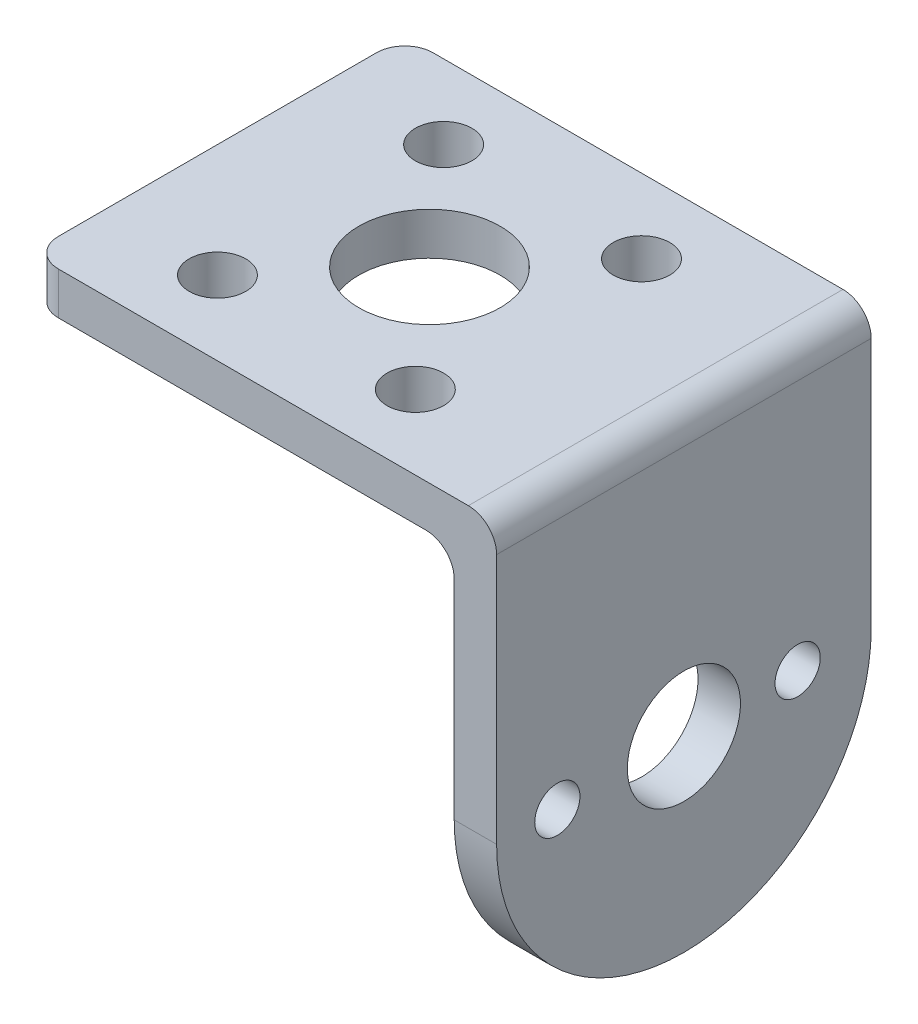
ISO-10303-21;
HEADER;
FILE_DESCRIPTION(('STEP AP214'),'2;1');
FILE_NAME('part.step','',(''),(''),'','','');
FILE_SCHEMA(('AUTOMOTIVE_DESIGN { 1 0 10303 214 1 1 1 1 }'));
ENDSEC;
DATA;
#1=APPLICATION_CONTEXT('core data for automotive mechanical design processes');
#2=APPLICATION_PROTOCOL_DEFINITION('international standard','automotive_design',2000,#1);
#3=PRODUCT_CONTEXT('',#1,'mechanical');
#4=PRODUCT('Part','Part','',(#3));
#5=PRODUCT_RELATED_PRODUCT_CATEGORY('part','',(#4));
#6=PRODUCT_DEFINITION_FORMATION('','',#4);
#7=PRODUCT_DEFINITION_CONTEXT('part definition',#1,'design');
#8=PRODUCT_DEFINITION('design','',#6,#7);
#9=PRODUCT_DEFINITION_SHAPE('','',#8);
#10=(LENGTH_UNIT() NAMED_UNIT(*) SI_UNIT(.MILLI.,.METRE.));
#11=(NAMED_UNIT(*) PLANE_ANGLE_UNIT() SI_UNIT($,.RADIAN.));
#12=(NAMED_UNIT(*) SI_UNIT($,.STERADIAN.) SOLID_ANGLE_UNIT());
#13=UNCERTAINTY_MEASURE_WITH_UNIT(LENGTH_MEASURE(1.E-05),#10,'distance_accuracy_value','');
#14=(GEOMETRIC_REPRESENTATION_CONTEXT(3) GLOBAL_UNCERTAINTY_ASSIGNED_CONTEXT((#13)) GLOBAL_UNIT_ASSIGNED_CONTEXT((#10,
#11,#12)) REPRESENTATION_CONTEXT('',''));
#15=CARTESIAN_POINT('',(0.,0.,0.));
#16=DIRECTION('',(0.,0.,1.));
#17=DIRECTION('',(1.,0.,0.));
#18=AXIS2_PLACEMENT_3D('',#15,#16,#17);
#19=CARTESIAN_POINT('',(-25.5407239819005,3.,-12.7703619909502));
#20=DIRECTION('',(1.,0.,0.));
#21=DIRECTION('',(0.,0.,-1.));
#22=AXIS2_PLACEMENT_3D('',#19,#20,#21);
#23=PLANE('',#22);
#24=DIRECTION('',(0.,0.,1.));
#25=VECTOR('',#24,1.);
#26=CARTESIAN_POINT('',(-25.5407239819005,3.,-12.7703619909502));
#27=LINE('',#26,#25);
#28=CARTESIAN_POINT('',(-25.5407239819005,3.,-10.7703619909502));
#29=VERTEX_POINT('',#28);
#30=CARTESIAN_POINT('',(-25.5407239819005,3.,11.7296380090498));
#31=VERTEX_POINT('',#30);
#32=EDGE_CURVE('E176',#29,#31,#27,.T.);
#33=ORIENTED_EDGE('',*,*,#32,.F.);
#34=DIRECTION('',(0.,-1.,0.));
#35=VECTOR('',#34,1.);
#36=CARTESIAN_POINT('',(-25.5407239819005,3.,-10.7703619909502));
#37=LINE('',#36,#35);
#38=CARTESIAN_POINT('',(-25.5407239819005,0.,-10.7703619909502));
#39=VERTEX_POINT('',#38);
#40=EDGE_CURVE('E192',#29,#39,#37,.T.);
#41=ORIENTED_EDGE('',*,*,#40,.T.);
#42=DIRECTION('',(0.,0.,1.));
#43=VECTOR('',#42,1.);
#44=CARTESIAN_POINT('',(-25.5407239819005,0.,-12.7703619909502));
#45=LINE('',#44,#43);
#46=CARTESIAN_POINT('',(-25.5407239819005,0.,11.7296380090498));
#47=VERTEX_POINT('',#46);
#48=EDGE_CURVE('E173',#39,#47,#45,.T.);
#49=ORIENTED_EDGE('',*,*,#48,.T.);
#50=DIRECTION('',(0.,-1.,0.));
#51=VECTOR('',#50,1.);
#52=CARTESIAN_POINT('',(-25.5407239819005,3.,11.7296380090498));
#53=LINE('',#52,#51);
#54=EDGE_CURVE('E184',#47,#31,#53,.F.);
#55=ORIENTED_EDGE('',*,*,#54,.T.);
#56=EDGE_LOOP('',(#33,#41,#49,#55));
#57=FACE_BOUND('',#56,.T.);
#58=ADVANCED_FACE('F35',(#57),#23,.F.);
#59=CARTESIAN_POINT('',(-25.5407239819005,3.,13.7296380090498));
#60=DIRECTION('',(0.,0.,-1.));
#61=DIRECTION('',(-1.,0.,0.));
#62=AXIS2_PLACEMENT_3D('',#59,#60,#61);
#63=PLANE('',#62);
#64=DIRECTION('',(0.,-1.,0.));
#65=VECTOR('',#64,1.);
#66=CARTESIAN_POINT('',(7.45927601809954,3.,13.7296380090498));
#67=LINE('',#66,#65);
#68=CARTESIAN_POINT('',(7.45927601809954,1.,13.7296380090498));
#69=VERTEX_POINT('',#68);
#70=CARTESIAN_POINT('',(7.45927601809954,-16.75,13.7296380090498));
#71=VERTEX_POINT('',#70);
#72=EDGE_CURVE('E111',#69,#71,#67,.T.);
#73=ORIENTED_EDGE('',*,*,#72,.F.);
#74=CARTESIAN_POINT('',(5.45927601809954,1.,13.7296380090498));
#75=DIRECTION('',(0.,0.,-1.));
#76=DIRECTION('',(-1.,0.,0.));
#77=AXIS2_PLACEMENT_3D('',#74,#75,#76);
#78=CIRCLE('',#77,2.);
#79=CARTESIAN_POINT('',(5.45927601809953,3.,13.7296380090498));
#80=VERTEX_POINT('',#79);
#81=EDGE_CURVE('E58',#69,#80,#78,.F.);
#82=ORIENTED_EDGE('',*,*,#81,.T.);
#83=DIRECTION('',(1.,0.,0.));
#84=VECTOR('',#83,1.);
#85=CARTESIAN_POINT('',(-25.5407239819005,3.,13.7296380090498));
#86=LINE('',#85,#84);
#87=CARTESIAN_POINT('',(-23.5407239819005,3.,13.7296380090498));
#88=VERTEX_POINT('',#87);
#89=EDGE_CURVE('E179',#88,#80,#86,.T.);
#90=ORIENTED_EDGE('',*,*,#89,.F.);
#91=DIRECTION('',(0.,-1.,0.));
#92=VECTOR('',#91,1.);
#93=CARTESIAN_POINT('',(-23.5407239819005,3.,13.7296380090498));
#94=LINE('',#93,#92);
#95=CARTESIAN_POINT('',(-23.5407239819005,0.,13.7296380090498));
#96=VERTEX_POINT('',#95);
#97=EDGE_CURVE('E207',#88,#96,#94,.T.);
#98=ORIENTED_EDGE('',*,*,#97,.T.);
#99=DIRECTION('',(1.,0.,0.));
#100=VECTOR('',#99,1.);
#101=CARTESIAN_POINT('',(-25.5407239819005,0.,13.7296380090498));
#102=LINE('',#101,#100);
#103=CARTESIAN_POINT('',(2.45927601809953,0.,13.7296380090498));
#104=VERTEX_POINT('',#103);
#105=EDGE_CURVE('E187',#96,#104,#102,.T.);
#106=ORIENTED_EDGE('',*,*,#105,.T.);
#107=CARTESIAN_POINT('',(2.45927601809954,-2.,13.7296380090498));
#108=DIRECTION('',(0.,0.,-1.));
#109=DIRECTION('',(-1.,0.,0.));
#110=AXIS2_PLACEMENT_3D('',#107,#108,#109);
#111=CIRCLE('',#110,2.);
#112=CARTESIAN_POINT('',(4.45927601809954,-2.,13.7296380090498));
#113=VERTEX_POINT('',#112);
#114=EDGE_CURVE('E11',#104,#113,#111,.T.);
#115=ORIENTED_EDGE('',*,*,#114,.T.);
#116=DIRECTION('',(0.,-1.,0.));
#117=VECTOR('',#116,1.);
#118=CARTESIAN_POINT('',(4.45927601809954,3.,13.7296380090498));
#119=LINE('',#118,#117);
#120=CARTESIAN_POINT('',(4.45927601809954,-16.75,13.7296380090498));
#121=VERTEX_POINT('',#120);
#122=EDGE_CURVE('E126',#113,#121,#119,.T.);
#123=ORIENTED_EDGE('',*,*,#122,.T.);
#124=DIRECTION('',(-1.,0.,0.));
#125=VECTOR('',#124,1.);
#126=CARTESIAN_POINT('',(7.45927601809954,-16.75,13.7296380090498));
#127=LINE('',#126,#125);
#128=EDGE_CURVE('E123',#71,#121,#127,.T.);
#129=ORIENTED_EDGE('',*,*,#128,.F.);
#130=EDGE_LOOP('',(#73,#82,#90,#98,#106,#115,#123,#129));
#131=FACE_BOUND('',#130,.T.);
#132=ADVANCED_FACE('F124',(#131),#63,.F.);
#133=CARTESIAN_POINT('',(-25.5407239819005,3.,-12.7703619909502));
#134=DIRECTION('',(0.,0.,1.));
#135=DIRECTION('',(1.,0.,0.));
#136=AXIS2_PLACEMENT_3D('',#133,#134,#135);
#137=PLANE('',#136);
#138=DIRECTION('',(-1.,0.,0.));
#139=VECTOR('',#138,1.);
#140=CARTESIAN_POINT('',(-25.5407239819005,3.,-12.7703619909502));
#141=LINE('',#140,#139);
#142=CARTESIAN_POINT('',(5.45927601809954,3.,-12.7703619909502));
#143=VERTEX_POINT('',#142);
#144=CARTESIAN_POINT('',(-23.5407239819005,3.,-12.7703619909502));
#145=VERTEX_POINT('',#144);
#146=EDGE_CURVE('E182',#143,#145,#141,.T.);
#147=ORIENTED_EDGE('',*,*,#146,.F.);
#148=CARTESIAN_POINT('',(5.45927601809953,1.,-12.7703619909502));
#149=DIRECTION('',(0.,0.,1.));
#150=DIRECTION('',(1.,0.,0.));
#151=AXIS2_PLACEMENT_3D('',#148,#149,#150);
#152=CIRCLE('',#151,2.);
#153=CARTESIAN_POINT('',(7.45927601809953,1.,-12.7703619909502));
#154=VERTEX_POINT('',#153);
#155=EDGE_CURVE('E218',#143,#154,#152,.F.);
#156=ORIENTED_EDGE('',*,*,#155,.T.);
#157=DIRECTION('',(0.,1.,0.));
#158=VECTOR('',#157,1.);
#159=CARTESIAN_POINT('',(7.45927601809953,3.,-12.7703619909502));
#160=LINE('',#159,#158);
#161=CARTESIAN_POINT('',(7.45927601809953,-16.75,-12.7703619909502));
#162=VERTEX_POINT('',#161);
#163=EDGE_CURVE('E120',#162,#154,#160,.T.);
#164=ORIENTED_EDGE('',*,*,#163,.F.);
#165=DIRECTION('',(-1.,0.,0.));
#166=VECTOR('',#165,1.);
#167=CARTESIAN_POINT('',(7.45927601809953,-16.75,-12.7703619909502));
#168=LINE('',#167,#166);
#169=CARTESIAN_POINT('',(4.45927601809953,-16.75,-12.7703619909502));
#170=VERTEX_POINT('',#169);
#171=EDGE_CURVE('E130',#162,#170,#168,.T.);
#172=ORIENTED_EDGE('',*,*,#171,.T.);
#173=DIRECTION('',(0.,1.,0.));
#174=VECTOR('',#173,1.);
#175=CARTESIAN_POINT('',(4.45927601809953,3.,-12.7703619909502));
#176=LINE('',#175,#174);
#177=CARTESIAN_POINT('',(4.45927601809953,-2.,-12.7703619909502));
#178=VERTEX_POINT('',#177);
#179=EDGE_CURVE('E139',#170,#178,#176,.T.);
#180=ORIENTED_EDGE('',*,*,#179,.T.);
#181=CARTESIAN_POINT('',(2.45927601809953,-2.,-12.7703619909502));
#182=DIRECTION('',(0.,0.,1.));
#183=DIRECTION('',(1.,0.,0.));
#184=AXIS2_PLACEMENT_3D('',#181,#182,#183);
#185=CIRCLE('',#184,2.);
#186=CARTESIAN_POINT('',(2.45927601809953,0.,-12.7703619909502));
#187=VERTEX_POINT('',#186);
#188=EDGE_CURVE('E43',#178,#187,#185,.T.);
#189=ORIENTED_EDGE('',*,*,#188,.T.);
#190=DIRECTION('',(-1.,0.,0.));
#191=VECTOR('',#190,1.);
#192=CARTESIAN_POINT('',(-25.5407239819005,0.,-12.7703619909502));
#193=LINE('',#192,#191);
#194=CARTESIAN_POINT('',(-23.5407239819005,0.,-12.7703619909502));
#195=VERTEX_POINT('',#194);
#196=EDGE_CURVE('E180',#187,#195,#193,.T.);
#197=ORIENTED_EDGE('',*,*,#196,.T.);
#198=DIRECTION('',(0.,-1.,0.));
#199=VECTOR('',#198,1.);
#200=CARTESIAN_POINT('',(-23.5407239819005,3.,-12.7703619909502));
#201=LINE('',#200,#199);
#202=EDGE_CURVE('E200',#195,#145,#201,.F.);
#203=ORIENTED_EDGE('',*,*,#202,.T.);
#204=EDGE_LOOP('',(#147,#156,#164,#172,#180,#189,#197,#203));
#205=FACE_BOUND('',#204,.T.);
#206=ADVANCED_FACE('F221',(#205),#137,.F.);
#207=CARTESIAN_POINT('',(0.,3.,0.));
#208=DIRECTION('',(0.,1.,0.));
#209=DIRECTION('',(0.,0.,1.));
#210=AXIS2_PLACEMENT_3D('',#207,#208,#209);
#211=PLANE('',#210);
#212=CARTESIAN_POINT('',(-17.5407239819005,3.,-7.52036199095022));
#213=DIRECTION('',(0.,1.,0.));
#214=DIRECTION('',(0.,0.,1.));
#215=AXIS2_PLACEMENT_3D('',#212,#213,#214);
#216=CIRCLE('',#215,2.);
#217=CARTESIAN_POINT('',(-17.5407239819005,3.,-5.52036199095022));
#218=VERTEX_POINT('',#217);
#219=EDGE_CURVE('E156',#218,#218,#216,.T.);
#220=ORIENTED_EDGE('',*,*,#219,.F.);
#221=EDGE_LOOP('',(#220));
#222=FACE_BOUND('',#221,.T.);
#223=CARTESIAN_POINT('',(-3.54072398190047,3.,8.47963800904978));
#224=DIRECTION('',(0.,1.,0.));
#225=DIRECTION('',(0.,0.,1.));
#226=AXIS2_PLACEMENT_3D('',#223,#224,#225);
#227=CIRCLE('',#226,2.);
#228=CARTESIAN_POINT('',(-3.54072398190047,3.,10.4796380090498));
#229=VERTEX_POINT('',#228);
#230=EDGE_CURVE('E149',#229,#229,#227,.T.);
#231=ORIENTED_EDGE('',*,*,#230,.F.);
#232=EDGE_LOOP('',(#231));
#233=FACE_BOUND('',#232,.T.);
#234=CARTESIAN_POINT('',(-17.5407239819005,3.,8.47963800904978));
#235=DIRECTION('',(0.,1.,0.));
#236=DIRECTION('',(0.,0.,1.));
#237=AXIS2_PLACEMENT_3D('',#234,#235,#236);
#238=CIRCLE('',#237,2.);
#239=CARTESIAN_POINT('',(-17.5407239819005,3.,10.4796380090498));
#240=VERTEX_POINT('',#239);
#241=EDGE_CURVE('E129',#240,#240,#238,.T.);
#242=ORIENTED_EDGE('',*,*,#241,.F.);
#243=EDGE_LOOP('',(#242));
#244=FACE_BOUND('',#243,.T.);
#245=CARTESIAN_POINT('',(-3.54072398190047,3.,-7.52036199095022));
#246=DIRECTION('',(0.,1.,0.));
#247=DIRECTION('',(0.,0.,1.));
#248=AXIS2_PLACEMENT_3D('',#245,#246,#247);
#249=CIRCLE('',#248,2.);
#250=CARTESIAN_POINT('',(-3.54072398190047,3.,-5.52036199095022));
#251=VERTEX_POINT('',#250);
#252=EDGE_CURVE('E155',#251,#251,#249,.T.);
#253=ORIENTED_EDGE('',*,*,#252,.F.);
#254=EDGE_LOOP('',(#253));
#255=FACE_BOUND('',#254,.T.);
#256=CARTESIAN_POINT('',(-10.5407239819005,3.,0.479638009049774));
#257=DIRECTION('',(0.,1.,0.));
#258=DIRECTION('',(0.,0.,1.));
#259=AXIS2_PLACEMENT_3D('',#256,#257,#258);
#260=CIRCLE('',#259,5.);
#261=CARTESIAN_POINT('',(-10.5407239819005,3.,5.47963800904977));
#262=VERTEX_POINT('',#261);
#263=EDGE_CURVE('E167',#262,#262,#260,.T.);
#264=ORIENTED_EDGE('',*,*,#263,.F.);
#265=EDGE_LOOP('',(#264));
#266=FACE_BOUND('',#265,.T.);
#267=ORIENTED_EDGE('',*,*,#89,.T.);
#268=DIRECTION('',(0.,0.,1.));
#269=VECTOR('',#268,1.);
#270=CARTESIAN_POINT('',(5.45927601809954,3.,0.));
#271=LINE('',#270,#269);
#272=EDGE_CURVE('E50',#80,#143,#271,.F.);
#273=ORIENTED_EDGE('',*,*,#272,.T.);
#274=ORIENTED_EDGE('',*,*,#146,.T.);
#275=CARTESIAN_POINT('',(-23.5407239819005,3.,-10.7703619909502));
#276=DIRECTION('',(0.,1.,0.));
#277=DIRECTION('',(0.,0.,1.));
#278=AXIS2_PLACEMENT_3D('',#275,#276,#277);
#279=CIRCLE('',#278,2.);
#280=EDGE_CURVE('E205',#145,#29,#279,.T.);
#281=ORIENTED_EDGE('',*,*,#280,.T.);
#282=ORIENTED_EDGE('',*,*,#32,.T.);
#283=CARTESIAN_POINT('',(-23.5407239819005,3.,11.7296380090498));
#284=DIRECTION('',(0.,1.,0.));
#285=DIRECTION('',(0.,0.,1.));
#286=AXIS2_PLACEMENT_3D('',#283,#284,#285);
#287=CIRCLE('',#286,2.);
#288=EDGE_CURVE('E203',#31,#88,#287,.T.);
#289=ORIENTED_EDGE('',*,*,#288,.T.);
#290=EDGE_LOOP('',(#267,#273,#274,#281,#282,#289));
#291=FACE_BOUND('',#290,.T.);
#292=ADVANCED_FACE('F338',(#222,#233,#244,#255,#266,#291),#211,.T.);
#293=CARTESIAN_POINT('',(0.,0.,0.));
#294=DIRECTION('',(0.,1.,0.));
#295=DIRECTION('',(0.,0.,1.));
#296=AXIS2_PLACEMENT_3D('',#293,#294,#295);
#297=PLANE('',#296);
#298=CARTESIAN_POINT('',(-17.5407239819005,0.,-7.52036199095022));
#299=DIRECTION('',(0.,1.,0.));
#300=DIRECTION('',(0.,0.,1.));
#301=AXIS2_PLACEMENT_3D('',#298,#299,#300);
#302=CIRCLE('',#301,2.);
#303=CARTESIAN_POINT('',(-17.5407239819005,0.,-5.52036199095022));
#304=VERTEX_POINT('',#303);
#305=EDGE_CURVE('E152',#304,#304,#302,.T.);
#306=ORIENTED_EDGE('',*,*,#305,.T.);
#307=EDGE_LOOP('',(#306));
#308=FACE_BOUND('',#307,.T.);
#309=CARTESIAN_POINT('',(-3.54072398190047,0.,8.47963800904978));
#310=DIRECTION('',(0.,1.,0.));
#311=DIRECTION('',(0.,0.,1.));
#312=AXIS2_PLACEMENT_3D('',#309,#310,#311);
#313=CIRCLE('',#312,2.);
#314=CARTESIAN_POINT('',(-3.54072398190047,0.,10.4796380090498));
#315=VERTEX_POINT('',#314);
#316=EDGE_CURVE('E159',#315,#315,#313,.T.);
#317=ORIENTED_EDGE('',*,*,#316,.T.);
#318=EDGE_LOOP('',(#317));
#319=FACE_BOUND('',#318,.T.);
#320=CARTESIAN_POINT('',(-17.5407239819005,0.,8.47963800904978));
#321=DIRECTION('',(0.,1.,0.));
#322=DIRECTION('',(0.,0.,1.));
#323=AXIS2_PLACEMENT_3D('',#320,#321,#322);
#324=CIRCLE('',#323,2.);
#325=CARTESIAN_POINT('',(-17.5407239819005,0.,10.4796380090498));
#326=VERTEX_POINT('',#325);
#327=EDGE_CURVE('E146',#326,#326,#324,.T.);
#328=ORIENTED_EDGE('',*,*,#327,.T.);
#329=EDGE_LOOP('',(#328));
#330=FACE_BOUND('',#329,.T.);
#331=CARTESIAN_POINT('',(-3.54072398190047,0.,-7.52036199095022));
#332=DIRECTION('',(0.,1.,0.));
#333=DIRECTION('',(0.,0.,1.));
#334=AXIS2_PLACEMENT_3D('',#331,#332,#333);
#335=CIRCLE('',#334,2.);
#336=CARTESIAN_POINT('',(-3.54072398190047,0.,-5.52036199095022));
#337=VERTEX_POINT('',#336);
#338=EDGE_CURVE('E164',#337,#337,#335,.T.);
#339=ORIENTED_EDGE('',*,*,#338,.T.);
#340=EDGE_LOOP('',(#339));
#341=FACE_BOUND('',#340,.T.);
#342=CARTESIAN_POINT('',(-10.5407239819005,0.,0.479638009049774));
#343=DIRECTION('',(0.,1.,0.));
#344=DIRECTION('',(0.,0.,1.));
#345=AXIS2_PLACEMENT_3D('',#342,#343,#344);
#346=CIRCLE('',#345,5.);
#347=CARTESIAN_POINT('',(-10.5407239819005,0.,5.47963800904977));
#348=VERTEX_POINT('',#347);
#349=EDGE_CURVE('E170',#348,#348,#346,.T.);
#350=ORIENTED_EDGE('',*,*,#349,.T.);
#351=EDGE_LOOP('',(#350));
#352=FACE_BOUND('',#351,.T.);
#353=ORIENTED_EDGE('',*,*,#196,.F.);
#354=DIRECTION('',(0.,0.,-1.));
#355=VECTOR('',#354,1.);
#356=CARTESIAN_POINT('',(2.45927601809954,0.,13.7296380090498));
#357=LINE('',#356,#355);
#358=EDGE_CURVE('E213',#187,#104,#357,.F.);
#359=ORIENTED_EDGE('',*,*,#358,.T.);
#360=ORIENTED_EDGE('',*,*,#105,.F.);
#361=CARTESIAN_POINT('',(-23.5407239819005,0.,11.7296380090498));
#362=DIRECTION('',(0.,1.,0.));
#363=DIRECTION('',(0.,0.,1.));
#364=AXIS2_PLACEMENT_3D('',#361,#362,#363);
#365=CIRCLE('',#364,2.);
#366=EDGE_CURVE('E195',#96,#47,#365,.F.);
#367=ORIENTED_EDGE('',*,*,#366,.T.);
#368=ORIENTED_EDGE('',*,*,#48,.F.);
#369=CARTESIAN_POINT('',(-23.5407239819005,0.,-10.7703619909502));
#370=DIRECTION('',(0.,1.,0.));
#371=DIRECTION('',(0.,0.,1.));
#372=AXIS2_PLACEMENT_3D('',#369,#370,#371);
#373=CIRCLE('',#372,2.);
#374=EDGE_CURVE('E197',#39,#195,#373,.F.);
#375=ORIENTED_EDGE('',*,*,#374,.T.);
#376=EDGE_LOOP('',(#353,#359,#360,#367,#368,#375));
#377=FACE_BOUND('',#376,.T.);
#378=ADVANCED_FACE('F227',(#308,#319,#330,#341,#352,#377),#297,.F.);
#379=CARTESIAN_POINT('',(-10.5407239819005,0.,0.479638009049774));
#380=DIRECTION('',(0.,1.,0.));
#381=DIRECTION('',(0.,0.,1.));
#382=AXIS2_PLACEMENT_3D('',#379,#380,#381);
#383=CYLINDRICAL_SURFACE('',#382,5.);
#384=ORIENTED_EDGE('',*,*,#349,.F.);
#385=EDGE_LOOP('',(#384));
#386=FACE_BOUND('',#385,.T.);
#387=ORIENTED_EDGE('',*,*,#263,.T.);
#388=EDGE_LOOP('',(#387));
#389=FACE_BOUND('',#388,.T.);
#390=ADVANCED_FACE('F337',(#386,#389),#383,.F.);
#391=CARTESIAN_POINT('',(-3.54072398190047,0.,-7.52036199095022));
#392=DIRECTION('',(0.,1.,0.));
#393=DIRECTION('',(0.,0.,1.));
#394=AXIS2_PLACEMENT_3D('',#391,#392,#393);
#395=CYLINDRICAL_SURFACE('',#394,2.);
#396=ORIENTED_EDGE('',*,*,#338,.F.);
#397=EDGE_LOOP('',(#396));
#398=FACE_BOUND('',#397,.T.);
#399=ORIENTED_EDGE('',*,*,#252,.T.);
#400=EDGE_LOOP('',(#399));
#401=FACE_BOUND('',#400,.T.);
#402=ADVANCED_FACE('F431',(#398,#401),#395,.F.);
#403=CARTESIAN_POINT('',(-17.5407239819005,0.,8.47963800904978));
#404=DIRECTION('',(0.,1.,0.));
#405=DIRECTION('',(0.,0.,1.));
#406=AXIS2_PLACEMENT_3D('',#403,#404,#405);
#407=CYLINDRICAL_SURFACE('',#406,2.);
#408=ORIENTED_EDGE('',*,*,#327,.F.);
#409=EDGE_LOOP('',(#408));
#410=FACE_BOUND('',#409,.T.);
#411=ORIENTED_EDGE('',*,*,#241,.T.);
#412=EDGE_LOOP('',(#411));
#413=FACE_BOUND('',#412,.T.);
#414=ADVANCED_FACE('F421',(#410,#413),#407,.F.);
#415=CARTESIAN_POINT('',(-3.54072398190047,0.,8.47963800904978));
#416=DIRECTION('',(0.,1.,0.));
#417=DIRECTION('',(0.,0.,1.));
#418=AXIS2_PLACEMENT_3D('',#415,#416,#417);
#419=CYLINDRICAL_SURFACE('',#418,2.);
#420=ORIENTED_EDGE('',*,*,#316,.F.);
#421=EDGE_LOOP('',(#420));
#422=FACE_BOUND('',#421,.T.);
#423=ORIENTED_EDGE('',*,*,#230,.T.);
#424=EDGE_LOOP('',(#423));
#425=FACE_BOUND('',#424,.T.);
#426=ADVANCED_FACE('F411',(#422,#425),#419,.F.);
#427=CARTESIAN_POINT('',(-17.5407239819005,0.,-7.52036199095022));
#428=DIRECTION('',(0.,1.,0.));
#429=DIRECTION('',(0.,0.,1.));
#430=AXIS2_PLACEMENT_3D('',#427,#428,#429);
#431=CYLINDRICAL_SURFACE('',#430,2.);
#432=ORIENTED_EDGE('',*,*,#305,.F.);
#433=EDGE_LOOP('',(#432));
#434=FACE_BOUND('',#433,.T.);
#435=ORIENTED_EDGE('',*,*,#219,.T.);
#436=EDGE_LOOP('',(#435));
#437=FACE_BOUND('',#436,.T.);
#438=ADVANCED_FACE('F267',(#434,#437),#431,.F.);
#439=CARTESIAN_POINT('',(4.45927601809954,-16.75,0.479638009049773));
#440=DIRECTION('',(1.,0.,0.));
#441=DIRECTION('',(0.,0.,-1.));
#442=AXIS2_PLACEMENT_3D('',#439,#440,#441);
#443=PLANE('',#442);
#444=CARTESIAN_POINT('',(4.45927601809953,-16.75,-7.56722861372516));
#445=DIRECTION('',(-1.,0.,0.));
#446=DIRECTION('',(0.,0.,1.));
#447=AXIS2_PLACEMENT_3D('',#444,#445,#446);
#448=CIRCLE('',#447,1.6);
#449=CARTESIAN_POINT('',(4.45927601809953,-16.75,-5.96722861372516));
#450=VERTEX_POINT('',#449);
#451=EDGE_CURVE('E243',#450,#450,#448,.T.);
#452=ORIENTED_EDGE('',*,*,#451,.F.);
#453=EDGE_LOOP('',(#452));
#454=FACE_BOUND('',#453,.T.);
#455=CARTESIAN_POINT('',(4.45927601809954,-16.75,9.43277138627484));
#456=DIRECTION('',(-1.,0.,0.));
#457=DIRECTION('',(0.,0.,1.));
#458=AXIS2_PLACEMENT_3D('',#455,#456,#457);
#459=CIRCLE('',#458,1.6);
#460=CARTESIAN_POINT('',(4.45927601809954,-16.75,11.0327713862748));
#461=VERTEX_POINT('',#460);
#462=EDGE_CURVE('E249',#461,#461,#459,.T.);
#463=ORIENTED_EDGE('',*,*,#462,.F.);
#464=EDGE_LOOP('',(#463));
#465=FACE_BOUND('',#464,.T.);
#466=CARTESIAN_POINT('',(4.45927601809954,-16.75,0.479638009049773));
#467=DIRECTION('',(-1.,0.,0.));
#468=DIRECTION('',(0.,0.,1.));
#469=AXIS2_PLACEMENT_3D('',#466,#467,#468);
#470=CIRCLE('',#469,4.);
#471=CARTESIAN_POINT('',(4.45927601809954,-16.75,4.47963800904977));
#472=VERTEX_POINT('',#471);
#473=EDGE_CURVE('E237',#472,#472,#470,.T.);
#474=ORIENTED_EDGE('',*,*,#473,.F.);
#475=EDGE_LOOP('',(#474));
#476=FACE_BOUND('',#475,.T.);
#477=ORIENTED_EDGE('',*,*,#122,.F.);
#478=DIRECTION('',(0.,0.,-1.));
#479=VECTOR('',#478,1.);
#480=CARTESIAN_POINT('',(4.45927601809953,-2.,-12.7703619909502));
#481=LINE('',#480,#479);
#482=EDGE_CURVE('E210',#113,#178,#481,.T.);
#483=ORIENTED_EDGE('',*,*,#482,.T.);
#484=ORIENTED_EDGE('',*,*,#179,.F.);
#485=CARTESIAN_POINT('',(4.45927601809954,-16.75,0.479638009049773));
#486=DIRECTION('',(1.,0.,0.));
#487=DIRECTION('',(0.,0.,-1.));
#488=AXIS2_PLACEMENT_3D('',#485,#486,#487);
#489=CIRCLE('',#488,13.25);
#490=EDGE_CURVE('E144',#121,#170,#489,.T.);
#491=ORIENTED_EDGE('',*,*,#490,.F.);
#492=EDGE_LOOP('',(#477,#483,#484,#491));
#493=FACE_BOUND('',#492,.T.);
#494=ADVANCED_FACE('F234',(#454,#465,#476,#493),#443,.F.);
#495=CARTESIAN_POINT('',(7.45927601809954,-16.75,0.479638009049773));
#496=DIRECTION('',(-1.,0.,0.));
#497=DIRECTION('',(0.,0.,1.));
#498=AXIS2_PLACEMENT_3D('',#495,#496,#497);
#499=CYLINDRICAL_SURFACE('',#498,13.25);
#500=ORIENTED_EDGE('',*,*,#490,.T.);
#501=ORIENTED_EDGE('',*,*,#171,.F.);
#502=CARTESIAN_POINT('',(7.45927601809954,-16.75,0.479638009049773));
#503=DIRECTION('',(1.,0.,0.));
#504=DIRECTION('',(0.,0.,-1.));
#505=AXIS2_PLACEMENT_3D('',#502,#503,#504);
#506=CIRCLE('',#505,13.25);
#507=EDGE_CURVE('E116',#71,#162,#506,.T.);
#508=ORIENTED_EDGE('',*,*,#507,.F.);
#509=ORIENTED_EDGE('',*,*,#128,.T.);
#510=EDGE_LOOP('',(#500,#501,#508,#509));
#511=FACE_BOUND('',#510,.T.);
#512=ADVANCED_FACE('F132',(#511),#499,.T.);
#513=CARTESIAN_POINT('',(7.45927601809954,-16.75,0.479638009049773));
#514=DIRECTION('',(1.,0.,0.));
#515=DIRECTION('',(0.,0.,-1.));
#516=AXIS2_PLACEMENT_3D('',#513,#514,#515);
#517=PLANE('',#516);
#518=CARTESIAN_POINT('',(7.45927601809954,-16.75,-7.56722861372516));
#519=DIRECTION('',(-1.,0.,0.));
#520=DIRECTION('',(0.,0.,1.));
#521=AXIS2_PLACEMENT_3D('',#518,#519,#520);
#522=CIRCLE('',#521,1.6);
#523=CARTESIAN_POINT('',(7.45927601809954,-16.75,-5.96722861372516));
#524=VERTEX_POINT('',#523);
#525=EDGE_CURVE('E246',#524,#524,#522,.T.);
#526=ORIENTED_EDGE('',*,*,#525,.T.);
#527=EDGE_LOOP('',(#526));
#528=FACE_BOUND('',#527,.T.);
#529=CARTESIAN_POINT('',(7.45927601809954,-16.75,9.43277138627484));
#530=DIRECTION('',(-1.,0.,0.));
#531=DIRECTION('',(0.,0.,1.));
#532=AXIS2_PLACEMENT_3D('',#529,#530,#531);
#533=CIRCLE('',#532,1.6);
#534=CARTESIAN_POINT('',(7.45927601809954,-16.75,11.0327713862748));
#535=VERTEX_POINT('',#534);
#536=EDGE_CURVE('E240',#535,#535,#533,.T.);
#537=ORIENTED_EDGE('',*,*,#536,.T.);
#538=EDGE_LOOP('',(#537));
#539=FACE_BOUND('',#538,.T.);
#540=CARTESIAN_POINT('',(7.45927601809954,-16.75,0.479638009049773));
#541=DIRECTION('',(-1.,0.,0.));
#542=DIRECTION('',(0.,0.,1.));
#543=AXIS2_PLACEMENT_3D('',#540,#541,#542);
#544=CIRCLE('',#543,4.);
#545=CARTESIAN_POINT('',(7.45927601809954,-16.75,4.47963800904977));
#546=VERTEX_POINT('',#545);
#547=EDGE_CURVE('E142',#546,#546,#544,.T.);
#548=ORIENTED_EDGE('',*,*,#547,.T.);
#549=EDGE_LOOP('',(#548));
#550=FACE_BOUND('',#549,.T.);
#551=ORIENTED_EDGE('',*,*,#163,.T.);
#552=DIRECTION('',(0.,0.,1.));
#553=VECTOR('',#552,1.);
#554=CARTESIAN_POINT('',(7.45927601809954,1.,0.479638009049773));
#555=LINE('',#554,#553);
#556=EDGE_CURVE('E119',#154,#69,#555,.T.);
#557=ORIENTED_EDGE('',*,*,#556,.T.);
#558=ORIENTED_EDGE('',*,*,#72,.T.);
#559=ORIENTED_EDGE('',*,*,#507,.T.);
#560=EDGE_LOOP('',(#551,#557,#558,#559));
#561=FACE_BOUND('',#560,.T.);
#562=ADVANCED_FACE('F114',(#528,#539,#550,#561),#517,.T.);
#563=CARTESIAN_POINT('',(7.45927601809954,-16.75,0.479638009049773));
#564=DIRECTION('',(-1.,0.,0.));
#565=DIRECTION('',(0.,0.,1.));
#566=AXIS2_PLACEMENT_3D('',#563,#564,#565);
#567=CYLINDRICAL_SURFACE('',#566,4.);
#568=ORIENTED_EDGE('',*,*,#547,.F.);
#569=EDGE_LOOP('',(#568));
#570=FACE_BOUND('',#569,.T.);
#571=ORIENTED_EDGE('',*,*,#473,.T.);
#572=EDGE_LOOP('',(#571));
#573=FACE_BOUND('',#572,.T.);
#574=ADVANCED_FACE('F261',(#570,#573),#567,.F.);
#575=CARTESIAN_POINT('',(7.45927601809954,-16.75,9.43277138627484));
#576=DIRECTION('',(-1.,0.,0.));
#577=DIRECTION('',(0.,0.,1.));
#578=AXIS2_PLACEMENT_3D('',#575,#576,#577);
#579=CYLINDRICAL_SURFACE('',#578,1.6);
#580=ORIENTED_EDGE('',*,*,#536,.F.);
#581=EDGE_LOOP('',(#580));
#582=FACE_BOUND('',#581,.T.);
#583=ORIENTED_EDGE('',*,*,#462,.T.);
#584=EDGE_LOOP('',(#583));
#585=FACE_BOUND('',#584,.T.);
#586=ADVANCED_FACE('F257',(#582,#585),#579,.F.);
#587=CARTESIAN_POINT('',(7.45927601809954,-16.75,-7.56722861372516));
#588=DIRECTION('',(-1.,0.,0.));
#589=DIRECTION('',(0.,0.,1.));
#590=AXIS2_PLACEMENT_3D('',#587,#588,#589);
#591=CYLINDRICAL_SURFACE('',#590,1.6);
#592=ORIENTED_EDGE('',*,*,#525,.F.);
#593=EDGE_LOOP('',(#592));
#594=FACE_BOUND('',#593,.T.);
#595=ORIENTED_EDGE('',*,*,#451,.T.);
#596=EDGE_LOOP('',(#595));
#597=FACE_BOUND('',#596,.T.);
#598=ADVANCED_FACE('F260',(#594,#597),#591,.F.);
#599=CARTESIAN_POINT('',(-23.5407239819005,3.,-10.7703619909502));
#600=DIRECTION('',(0.,-1.,0.));
#601=DIRECTION('',(0.,0.,-1.));
#602=AXIS2_PLACEMENT_3D('',#599,#600,#601);
#603=CYLINDRICAL_SURFACE('',#602,2.);
#604=ORIENTED_EDGE('',*,*,#280,.F.);
#605=ORIENTED_EDGE('',*,*,#202,.F.);
#606=ORIENTED_EDGE('',*,*,#374,.F.);
#607=ORIENTED_EDGE('',*,*,#40,.F.);
#608=EDGE_LOOP('',(#604,#605,#606,#607));
#609=FACE_BOUND('',#608,.T.);
#610=ADVANCED_FACE('F292',(#609),#603,.T.);
#611=CARTESIAN_POINT('',(-23.5407239819005,3.,11.7296380090498));
#612=DIRECTION('',(0.,-1.,0.));
#613=DIRECTION('',(0.,0.,-1.));
#614=AXIS2_PLACEMENT_3D('',#611,#612,#613);
#615=CYLINDRICAL_SURFACE('',#614,2.);
#616=ORIENTED_EDGE('',*,*,#288,.F.);
#617=ORIENTED_EDGE('',*,*,#54,.F.);
#618=ORIENTED_EDGE('',*,*,#366,.F.);
#619=ORIENTED_EDGE('',*,*,#97,.F.);
#620=EDGE_LOOP('',(#616,#617,#618,#619));
#621=FACE_BOUND('',#620,.T.);
#622=ADVANCED_FACE('F295',(#621),#615,.T.);
#623=CARTESIAN_POINT('',(2.45927601809954,-2.,0.479638009049774));
#624=DIRECTION('',(0.,0.,1.));
#625=DIRECTION('',(1.,0.,0.));
#626=AXIS2_PLACEMENT_3D('',#623,#624,#625);
#627=CYLINDRICAL_SURFACE('',#626,2.);
#628=ORIENTED_EDGE('',*,*,#114,.F.);
#629=ORIENTED_EDGE('',*,*,#358,.F.);
#630=ORIENTED_EDGE('',*,*,#188,.F.);
#631=ORIENTED_EDGE('',*,*,#482,.F.);
#632=EDGE_LOOP('',(#628,#629,#630,#631));
#633=FACE_BOUND('',#632,.T.);
#634=ADVANCED_FACE('F232',(#633),#627,.F.);
#635=CARTESIAN_POINT('',(5.45927601809954,1.,0.479638009049773));
#636=DIRECTION('',(0.,0.,1.));
#637=DIRECTION('',(1.,0.,0.));
#638=AXIS2_PLACEMENT_3D('',#635,#636,#637);
#639=CYLINDRICAL_SURFACE('',#638,2.);
#640=ORIENTED_EDGE('',*,*,#155,.F.);
#641=ORIENTED_EDGE('',*,*,#272,.F.);
#642=ORIENTED_EDGE('',*,*,#81,.F.);
#643=ORIENTED_EDGE('',*,*,#556,.F.);
#644=EDGE_LOOP('',(#640,#641,#642,#643));
#645=FACE_BOUND('',#644,.T.);
#646=ADVANCED_FACE('F37',(#645),#639,.T.);
#647=CLOSED_SHELL('',(#58,#132,#206,#292,#378,#390,#402,#414,#426,#438,#494,#512,#562,#574,#586,
#598,#610,#622,#634,#646));
#648=MANIFOLD_SOLID_BREP('B2',#647);
#649=ADVANCED_BREP_SHAPE_REPRESENTATION('',(#18,#648),#14);
#650=SHAPE_DEFINITION_REPRESENTATION(#9,#649);
ENDSEC;
END-ISO-10303-21;
